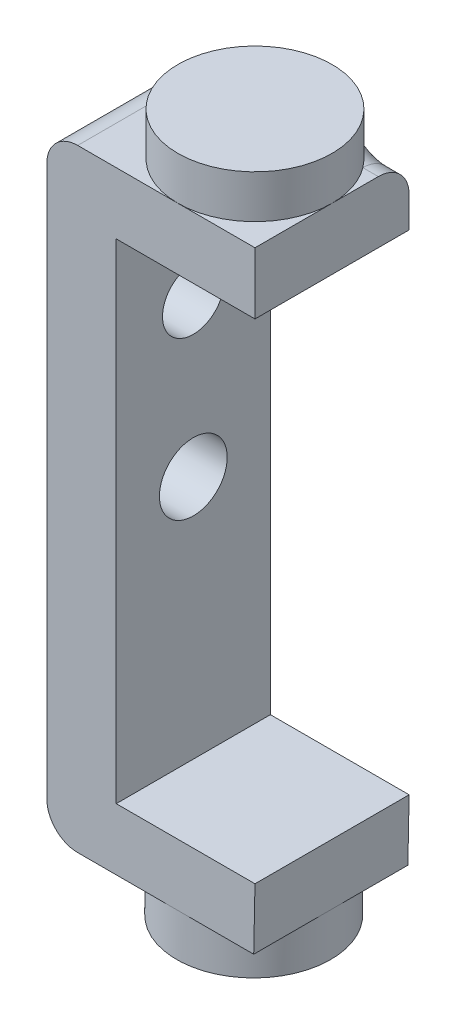
ISO-10303-21;
HEADER;
FILE_DESCRIPTION(('STEP AP214'),'2;1');
FILE_NAME('part.step','',(''),(''),'','','');
FILE_SCHEMA(('AUTOMOTIVE_DESIGN { 1 0 10303 214 1 1 1 1 }'));
ENDSEC;
DATA;
#1=APPLICATION_CONTEXT('core data for automotive mechanical design processes');
#2=APPLICATION_PROTOCOL_DEFINITION('international standard','automotive_design',2000,#1);
#3=PRODUCT_CONTEXT('',#1,'mechanical');
#4=PRODUCT('Part','Part','',(#3));
#5=PRODUCT_RELATED_PRODUCT_CATEGORY('part','',(#4));
#6=PRODUCT_DEFINITION_FORMATION('','',#4);
#7=PRODUCT_DEFINITION_CONTEXT('part definition',#1,'design');
#8=PRODUCT_DEFINITION('design','',#6,#7);
#9=PRODUCT_DEFINITION_SHAPE('','',#8);
#10=(LENGTH_UNIT() NAMED_UNIT(*) SI_UNIT(.MILLI.,.METRE.));
#11=(NAMED_UNIT(*) PLANE_ANGLE_UNIT() SI_UNIT($,.RADIAN.));
#12=(NAMED_UNIT(*) SI_UNIT($,.STERADIAN.) SOLID_ANGLE_UNIT());
#13=UNCERTAINTY_MEASURE_WITH_UNIT(LENGTH_MEASURE(1.E-05),#10,'distance_accuracy_value','');
#14=(GEOMETRIC_REPRESENTATION_CONTEXT(3) GLOBAL_UNCERTAINTY_ASSIGNED_CONTEXT((#13)) GLOBAL_UNIT_ASSIGNED_CONTEXT((#10,
#11,#12)) REPRESENTATION_CONTEXT('',''));
#15=CARTESIAN_POINT('',(0.,0.,0.));
#16=DIRECTION('',(0.,0.,1.));
#17=DIRECTION('',(1.,0.,0.));
#18=AXIS2_PLACEMENT_3D('',#15,#16,#17);
#19=CARTESIAN_POINT('',(-4.25,-9.93292427062988,5.));
#20=DIRECTION('',(0.,1.,0.));
#21=DIRECTION('',(0.,0.,1.));
#22=AXIS2_PLACEMENT_3D('',#19,#20,#21);
#23=PLANE('',#22);
#24=CARTESIAN_POINT('',(-0.040950298309327,-9.93292427062988,2.5));
#25=DIRECTION('',(0.,-1.,0.));
#26=DIRECTION('',(0.,0.,-1.));
#27=AXIS2_PLACEMENT_3D('',#24,#25,#26);
#28=CIRCLE('',#27,2.5);
#29=CARTESIAN_POINT('',(-0.040950298309327,-9.93292427062988,0.));
#30=VERTEX_POINT('',#29);
#31=CARTESIAN_POINT('',(2.45904970169067,-9.93292427062988,2.5));
#32=VERTEX_POINT('',#31);
#33=EDGE_CURVE('E181',#30,#32,#28,.T.);
#34=ORIENTED_EDGE('',*,*,#33,.F.);
#35=DIRECTION('',(1.,0.,0.));
#36=VECTOR('',#35,1.);
#37=CARTESIAN_POINT('',(-4.25,-9.93292427062988,0.));
#38=LINE('',#37,#36);
#39=CARTESIAN_POINT('',(2.45904970169067,-9.93292427062988,0.));
#40=VERTEX_POINT('',#39);
#41=EDGE_CURVE('E169',#30,#40,#38,.T.);
#42=ORIENTED_EDGE('',*,*,#41,.T.);
#43=DIRECTION('',(0.,0.,-1.));
#44=VECTOR('',#43,1.);
#45=CARTESIAN_POINT('',(2.45904970169067,-9.93292427062988,5.));
#46=LINE('',#45,#44);
#47=EDGE_CURVE('E182',#32,#40,#46,.T.);
#48=ORIENTED_EDGE('',*,*,#47,.F.);
#49=EDGE_LOOP('',(#34,#42,#48));
#50=FACE_BOUND('',#49,.T.);
#51=ADVANCED_FACE('F42',(#50),#23,.F.);
#52=CARTESIAN_POINT('',(-0.040950298309327,-9.93292427062988,5.));
#53=VERTEX_POINT('',#52);
#54=EDGE_CURVE('E190',#32,#53,#28,.T.);
#55=ORIENTED_EDGE('',*,*,#54,.F.);
#56=CARTESIAN_POINT('',(2.45904970169067,-9.93292427062988,5.));
#57=VERTEX_POINT('',#56);
#58=EDGE_CURVE('E259',#57,#32,#46,.T.);
#59=ORIENTED_EDGE('',*,*,#58,.F.);
#60=DIRECTION('',(1.,0.,0.));
#61=VECTOR('',#60,1.);
#62=CARTESIAN_POINT('',(-4.25,-9.93292427062988,5.));
#63=LINE('',#62,#61);
#64=EDGE_CURVE('E234',#53,#57,#63,.T.);
#65=ORIENTED_EDGE('',*,*,#64,.F.);
#66=EDGE_LOOP('',(#55,#59,#65));
#67=FACE_BOUND('',#66,.T.);
#68=ADVANCED_FACE('F385',(#67),#23,.F.);
#69=CARTESIAN_POINT('',(-4.25,9.93292427062988,5.));
#70=DIRECTION('',(0.,-1.,0.));
#71=DIRECTION('',(0.,0.,-1.));
#72=AXIS2_PLACEMENT_3D('',#69,#70,#71);
#73=PLANE('',#72);
#74=CARTESIAN_POINT('',(0.,9.93292427062988,2.5));
#75=DIRECTION('',(0.,1.,0.));
#76=DIRECTION('',(0.,0.,1.));
#77=AXIS2_PLACEMENT_3D('',#74,#75,#76);
#78=CIRCLE('',#77,2.5);
#79=CARTESIAN_POINT('',(0.,9.93292427062988,5.));
#80=VERTEX_POINT('',#79);
#81=CARTESIAN_POINT('',(2.5,9.93292427062988,2.5));
#82=VERTEX_POINT('',#81);
#83=EDGE_CURVE('E208',#80,#82,#78,.T.);
#84=ORIENTED_EDGE('',*,*,#83,.F.);
#85=DIRECTION('',(-1.,0.,0.));
#86=VECTOR('',#85,1.);
#87=CARTESIAN_POINT('',(-4.25,9.93292427062988,5.));
#88=LINE('',#87,#86);
#89=CARTESIAN_POINT('',(2.5,9.93292427062988,5.));
#90=VERTEX_POINT('',#89);
#91=EDGE_CURVE('E227',#90,#80,#88,.T.);
#92=ORIENTED_EDGE('',*,*,#91,.F.);
#93=DIRECTION('',(0.,0.,-1.));
#94=VECTOR('',#93,1.);
#95=CARTESIAN_POINT('',(2.5,9.93292427062988,5.));
#96=LINE('',#95,#94);
#97=EDGE_CURVE('E263',#90,#82,#96,.T.);
#98=ORIENTED_EDGE('',*,*,#97,.T.);
#99=EDGE_LOOP('',(#84,#92,#98));
#100=FACE_BOUND('',#99,.T.);
#101=ADVANCED_FACE('F389',(#100),#73,.F.);
#102=CARTESIAN_POINT('',(2.5,9.93292427062988,1.));
#103=VERTEX_POINT('',#102);
#104=EDGE_CURVE('E262',#82,#103,#96,.T.);
#105=ORIENTED_EDGE('',*,*,#104,.T.);
#106=DIRECTION('',(-1.,0.,0.));
#107=VECTOR('',#106,1.);
#108=CARTESIAN_POINT('',(0.,9.93292427062988,1.));
#109=LINE('',#108,#107);
#110=CARTESIAN_POINT('',(2.,9.93292427062988,1.));
#111=VERTEX_POINT('',#110);
#112=EDGE_CURVE('E295',#103,#111,#109,.T.);
#113=ORIENTED_EDGE('',*,*,#112,.T.);
#114=EDGE_CURVE('E193',#82,#111,#78,.T.);
#115=ORIENTED_EDGE('',*,*,#114,.F.);
#116=EDGE_LOOP('',(#105,#113,#115));
#117=FACE_BOUND('',#116,.T.);
#118=ADVANCED_FACE('F407',(#117),#73,.F.);
#119=CARTESIAN_POINT('',(2.5,-7.93292379379272,5.));
#120=DIRECTION('',(0.,-1.,0.));
#121=DIRECTION('',(0.,0.,-1.));
#122=AXIS2_PLACEMENT_3D('',#119,#120,#121);
#123=PLANE('',#122);
#124=DIRECTION('',(-1.,0.,0.));
#125=VECTOR('',#124,1.);
#126=CARTESIAN_POINT('',(2.5,-7.93292379379272,0.));
#127=LINE('',#126,#125);
#128=CARTESIAN_POINT('',(2.5,-7.93292379379272,0.));
#129=VERTEX_POINT('',#128);
#130=CARTESIAN_POINT('',(-2.,-7.93292379379272,0.));
#131=VERTEX_POINT('',#130);
#132=EDGE_CURVE('E207',#129,#131,#127,.T.);
#133=ORIENTED_EDGE('',*,*,#132,.T.);
#134=DIRECTION('',(0.,0.,-1.));
#135=VECTOR('',#134,1.);
#136=CARTESIAN_POINT('',(-2.,-7.93292379379272,5.));
#137=LINE('',#136,#135);
#138=CARTESIAN_POINT('',(-2.,-7.93292379379272,5.));
#139=VERTEX_POINT('',#138);
#140=EDGE_CURVE('E275',#139,#131,#137,.T.);
#141=ORIENTED_EDGE('',*,*,#140,.F.);
#142=DIRECTION('',(-1.,0.,0.));
#143=VECTOR('',#142,1.);
#144=CARTESIAN_POINT('',(2.5,-7.93292379379272,5.));
#145=LINE('',#144,#143);
#146=CARTESIAN_POINT('',(2.5,-7.93292379379272,5.));
#147=VERTEX_POINT('',#146);
#148=EDGE_CURVE('E213',#147,#139,#145,.T.);
#149=ORIENTED_EDGE('',*,*,#148,.F.);
#150=DIRECTION('',(0.,0.,-1.));
#151=VECTOR('',#150,1.);
#152=CARTESIAN_POINT('',(2.5,-7.93292379379272,5.));
#153=LINE('',#152,#151);
#154=EDGE_CURVE('E241',#147,#129,#153,.T.);
#155=ORIENTED_EDGE('',*,*,#154,.T.);
#156=EDGE_LOOP('',(#133,#141,#149,#155));
#157=FACE_BOUND('',#156,.T.);
#158=ADVANCED_FACE('F466',(#157),#123,.F.);
#159=CARTESIAN_POINT('',(-2.,-7.93292379379272,5.));
#160=DIRECTION('',(-1.,0.,0.));
#161=DIRECTION('',(0.,0.,1.));
#162=AXIS2_PLACEMENT_3D('',#159,#160,#161);
#163=PLANE('',#162);
#164=CARTESIAN_POINT('',(-2.,5.,2.5));
#165=DIRECTION('',(1.,0.,0.));
#166=DIRECTION('',(0.,0.,-1.));
#167=AXIS2_PLACEMENT_3D('',#164,#165,#166);
#168=CIRCLE('',#167,1.);
#169=CARTESIAN_POINT('',(-2.,5.,1.5));
#170=VERTEX_POINT('',#169);
#171=EDGE_CURVE('E283',#170,#170,#168,.T.);
#172=ORIENTED_EDGE('',*,*,#171,.F.);
#173=EDGE_LOOP('',(#172));
#174=FACE_BOUND('',#173,.T.);
#175=CARTESIAN_POINT('',(-2.,0.,2.5));
#176=DIRECTION('',(1.,0.,0.));
#177=DIRECTION('',(0.,0.,-1.));
#178=AXIS2_PLACEMENT_3D('',#175,#176,#177);
#179=CIRCLE('',#178,1.1);
#180=CARTESIAN_POINT('',(-2.,0.,1.4));
#181=VERTEX_POINT('',#180);
#182=EDGE_CURVE('E444',#181,#181,#179,.T.);
#183=ORIENTED_EDGE('',*,*,#182,.F.);
#184=EDGE_LOOP('',(#183));
#185=FACE_BOUND('',#184,.T.);
#186=DIRECTION('',(0.,1.,0.));
#187=VECTOR('',#186,1.);
#188=CARTESIAN_POINT('',(-2.,-7.93292379379272,0.));
#189=LINE('',#188,#187);
#190=CARTESIAN_POINT('',(-2.,7.93292379379272,0.));
#191=VERTEX_POINT('',#190);
#192=EDGE_CURVE('E245',#131,#191,#189,.T.);
#193=ORIENTED_EDGE('',*,*,#192,.T.);
#194=DIRECTION('',(0.,0.,-1.));
#195=VECTOR('',#194,1.);
#196=CARTESIAN_POINT('',(-2.,7.93292379379272,5.));
#197=LINE('',#196,#195);
#198=CARTESIAN_POINT('',(-2.,7.93292379379272,5.));
#199=VERTEX_POINT('',#198);
#200=EDGE_CURVE('E271',#199,#191,#197,.T.);
#201=ORIENTED_EDGE('',*,*,#200,.F.);
#202=DIRECTION('',(0.,1.,0.));
#203=VECTOR('',#202,1.);
#204=CARTESIAN_POINT('',(-2.,-7.93292379379272,5.));
#205=LINE('',#204,#203);
#206=EDGE_CURVE('E217',#139,#199,#205,.T.);
#207=ORIENTED_EDGE('',*,*,#206,.F.);
#208=ORIENTED_EDGE('',*,*,#140,.T.);
#209=EDGE_LOOP('',(#193,#201,#207,#208));
#210=FACE_BOUND('',#209,.T.);
#211=ADVANCED_FACE('F462',(#174,#185,#210),#163,.F.);
#212=CARTESIAN_POINT('',(-2.,7.93292379379272,5.));
#213=DIRECTION('',(0.,1.,0.));
#214=DIRECTION('',(0.,0.,1.));
#215=AXIS2_PLACEMENT_3D('',#212,#213,#214);
#216=PLANE('',#215);
#217=DIRECTION('',(1.,0.,0.));
#218=VECTOR('',#217,1.);
#219=CARTESIAN_POINT('',(-2.,7.93292379379272,0.));
#220=LINE('',#219,#218);
#221=CARTESIAN_POINT('',(2.5,7.93292379379272,0.));
#222=VERTEX_POINT('',#221);
#223=EDGE_CURVE('E248',#191,#222,#220,.T.);
#224=ORIENTED_EDGE('',*,*,#223,.T.);
#225=DIRECTION('',(0.,0.,-1.));
#226=VECTOR('',#225,1.);
#227=CARTESIAN_POINT('',(2.5,7.93292379379272,5.));
#228=LINE('',#227,#226);
#229=CARTESIAN_POINT('',(2.5,7.93292379379272,5.));
#230=VERTEX_POINT('',#229);
#231=EDGE_CURVE('E267',#230,#222,#228,.T.);
#232=ORIENTED_EDGE('',*,*,#231,.F.);
#233=DIRECTION('',(1.,0.,0.));
#234=VECTOR('',#233,1.);
#235=CARTESIAN_POINT('',(-2.,7.93292379379272,5.));
#236=LINE('',#235,#234);
#237=EDGE_CURVE('E220',#199,#230,#236,.T.);
#238=ORIENTED_EDGE('',*,*,#237,.F.);
#239=ORIENTED_EDGE('',*,*,#200,.T.);
#240=EDGE_LOOP('',(#224,#232,#238,#239));
#241=FACE_BOUND('',#240,.T.);
#242=ADVANCED_FACE('F465',(#241),#216,.F.);
#243=CARTESIAN_POINT('',(2.5,7.93292379379272,5.));
#244=DIRECTION('',(-1.,0.,0.));
#245=DIRECTION('',(0.,0.,1.));
#246=AXIS2_PLACEMENT_3D('',#243,#244,#245);
#247=PLANE('',#246);
#248=DIRECTION('',(0.,1.,0.));
#249=VECTOR('',#248,1.);
#250=CARTESIAN_POINT('',(2.5,7.93292379379272,0.));
#251=LINE('',#250,#249);
#252=CARTESIAN_POINT('',(2.5,8.93292427062988,0.));
#253=VERTEX_POINT('',#252);
#254=EDGE_CURVE('E179',#222,#253,#251,.T.);
#255=ORIENTED_EDGE('',*,*,#254,.T.);
#256=CARTESIAN_POINT('',(2.5,8.93292427062988,1.));
#257=DIRECTION('',(-1.,0.,0.));
#258=DIRECTION('',(0.,0.,1.));
#259=AXIS2_PLACEMENT_3D('',#256,#257,#258);
#260=CIRCLE('',#259,1.);
#261=EDGE_CURVE('E480',#253,#103,#260,.F.);
#262=ORIENTED_EDGE('',*,*,#261,.T.);
#263=ORIENTED_EDGE('',*,*,#104,.F.);
#264=ORIENTED_EDGE('',*,*,#97,.F.);
#265=DIRECTION('',(0.,1.,0.));
#266=VECTOR('',#265,1.);
#267=CARTESIAN_POINT('',(2.5,7.93292379379272,5.));
#268=LINE('',#267,#266);
#269=EDGE_CURVE('E223',#230,#90,#268,.T.);
#270=ORIENTED_EDGE('',*,*,#269,.F.);
#271=ORIENTED_EDGE('',*,*,#231,.T.);
#272=EDGE_LOOP('',(#255,#262,#263,#264,#270,#271));
#273=FACE_BOUND('',#272,.T.);
#274=ADVANCED_FACE('F405',(#273),#247,.F.);
#275=CARTESIAN_POINT('',(-2.,9.93292427062988,1.));
#276=VERTEX_POINT('',#275);
#277=EDGE_CURVE('E212',#276,#80,#78,.T.);
#278=ORIENTED_EDGE('',*,*,#277,.F.);
#279=DIRECTION('',(-1.,0.,0.));
#280=VECTOR('',#279,1.);
#281=CARTESIAN_POINT('',(-3.25,9.93292427062988,1.));
#282=LINE('',#281,#280);
#283=CARTESIAN_POINT('',(-3.25,9.93292427062988,1.));
#284=VERTEX_POINT('',#283);
#285=EDGE_CURVE('E484',#276,#284,#282,.T.);
#286=ORIENTED_EDGE('',*,*,#285,.T.);
#287=DIRECTION('',(0.,0.,-1.));
#288=VECTOR('',#287,1.);
#289=CARTESIAN_POINT('',(-3.25,9.93292427062988,5.));
#290=LINE('',#289,#288);
#291=CARTESIAN_POINT('',(-3.25,9.93292427062988,5.));
#292=VERTEX_POINT('',#291);
#293=EDGE_CURVE('E289',#284,#292,#290,.F.);
#294=ORIENTED_EDGE('',*,*,#293,.T.);
#295=EDGE_CURVE('E226',#80,#292,#88,.T.);
#296=ORIENTED_EDGE('',*,*,#295,.F.);
#297=EDGE_LOOP('',(#278,#286,#294,#296));
#298=FACE_BOUND('',#297,.T.);
#299=ADVANCED_FACE('F400',(#298),#73,.F.);
#300=CARTESIAN_POINT('',(-4.25,9.93292427062988,5.));
#301=DIRECTION('',(1.,0.,0.));
#302=DIRECTION('',(0.,0.,-1.));
#303=AXIS2_PLACEMENT_3D('',#300,#301,#302);
#304=PLANE('',#303);
#305=CARTESIAN_POINT('',(-4.25,5.,2.5));
#306=DIRECTION('',(1.,0.,0.));
#307=DIRECTION('',(0.,0.,-1.));
#308=AXIS2_PLACEMENT_3D('',#305,#306,#307);
#309=CIRCLE('',#308,1.);
#310=CARTESIAN_POINT('',(-4.25,5.,1.5));
#311=VERTEX_POINT('',#310);
#312=EDGE_CURVE('E188',#311,#311,#309,.T.);
#313=ORIENTED_EDGE('',*,*,#312,.T.);
#314=EDGE_LOOP('',(#313));
#315=FACE_BOUND('',#314,.T.);
#316=CARTESIAN_POINT('',(-4.25,0.,2.5));
#317=DIRECTION('',(1.,0.,0.));
#318=DIRECTION('',(0.,0.,-1.));
#319=AXIS2_PLACEMENT_3D('',#316,#317,#318);
#320=CIRCLE('',#319,1.1);
#321=CARTESIAN_POINT('',(-4.25,0.,1.4));
#322=VERTEX_POINT('',#321);
#323=EDGE_CURVE('E279',#322,#322,#320,.T.);
#324=ORIENTED_EDGE('',*,*,#323,.T.);
#325=EDGE_LOOP('',(#324));
#326=FACE_BOUND('',#325,.T.);
#327=DIRECTION('',(0.,0.,-1.));
#328=VECTOR('',#327,1.);
#329=CARTESIAN_POINT('',(-4.25,8.93292427062988,5.));
#330=LINE('',#329,#328);
#331=CARTESIAN_POINT('',(-4.25,8.93292427062988,5.));
#332=VERTEX_POINT('',#331);
#333=CARTESIAN_POINT('',(-4.25,8.93292427062988,1.));
#334=VERTEX_POINT('',#333);
#335=EDGE_CURVE('E196',#332,#334,#330,.T.);
#336=ORIENTED_EDGE('',*,*,#335,.T.);
#337=DIRECTION('',(0.,-1.,0.));
#338=VECTOR('',#337,1.);
#339=CARTESIAN_POINT('',(-4.25,-9.93292427062988,1.));
#340=LINE('',#339,#338);
#341=CARTESIAN_POINT('',(-4.25,-8.93292427062988,1.));
#342=VERTEX_POINT('',#341);
#343=EDGE_CURVE('E66',#334,#342,#340,.T.);
#344=ORIENTED_EDGE('',*,*,#343,.T.);
#345=DIRECTION('',(0.,0.,-1.));
#346=VECTOR('',#345,1.);
#347=CARTESIAN_POINT('',(-4.25,-8.93292427062988,5.));
#348=LINE('',#347,#346);
#349=CARTESIAN_POINT('',(-4.25,-8.93292427062988,5.));
#350=VERTEX_POINT('',#349);
#351=EDGE_CURVE('E493',#342,#350,#348,.F.);
#352=ORIENTED_EDGE('',*,*,#351,.T.);
#353=DIRECTION('',(0.,-1.,0.));
#354=VECTOR('',#353,1.);
#355=CARTESIAN_POINT('',(-4.25,9.93292427062988,5.));
#356=LINE('',#355,#354);
#357=EDGE_CURVE('E231',#332,#350,#356,.T.);
#358=ORIENTED_EDGE('',*,*,#357,.F.);
#359=EDGE_LOOP('',(#336,#344,#352,#358));
#360=FACE_BOUND('',#359,.T.);
#361=ADVANCED_FACE('F393',(#315,#326,#360),#304,.F.);
#362=CARTESIAN_POINT('',(-3.25,-9.93292427062988,5.));
#363=VERTEX_POINT('',#362);
#364=EDGE_CURVE('E235',#363,#53,#63,.T.);
#365=ORIENTED_EDGE('',*,*,#364,.F.);
#366=DIRECTION('',(0.,0.,-1.));
#367=VECTOR('',#366,1.);
#368=CARTESIAN_POINT('',(-3.25,-9.93292427062988,5.));
#369=LINE('',#368,#367);
#370=CARTESIAN_POINT('',(-3.25,-9.93292427062988,0.));
#371=VERTEX_POINT('',#370);
#372=EDGE_CURVE('E52',#363,#371,#369,.T.);
#373=ORIENTED_EDGE('',*,*,#372,.T.);
#374=EDGE_CURVE('E158',#371,#30,#38,.T.);
#375=ORIENTED_EDGE('',*,*,#374,.T.);
#376=EDGE_CURVE('E162',#53,#30,#28,.T.);
#377=ORIENTED_EDGE('',*,*,#376,.F.);
#378=EDGE_LOOP('',(#365,#373,#375,#377));
#379=FACE_BOUND('',#378,.T.);
#380=ADVANCED_FACE('F160',(#379),#23,.F.);
#381=CARTESIAN_POINT('',(2.5,-7.93292379379272,5.));
#382=DIRECTION('',(-0.999790450118637,0.020470853708955,0.));
#383=DIRECTION('',(-0.020470853708955,-0.999790450118637,0.));
#384=AXIS2_PLACEMENT_3D('',#381,#382,#383);
#385=PLANE('',#384);
#386=DIRECTION('',(0.020470853708955,0.999790450118637,0.));
#387=VECTOR('',#386,1.);
#388=CARTESIAN_POINT('',(2.5,-7.93292379379272,0.));
#389=LINE('',#388,#387);
#390=EDGE_CURVE('E168',#40,#129,#389,.T.);
#391=ORIENTED_EDGE('',*,*,#390,.T.);
#392=ORIENTED_EDGE('',*,*,#154,.F.);
#393=DIRECTION('',(0.020470853708955,0.999790450118637,0.));
#394=VECTOR('',#393,1.);
#395=CARTESIAN_POINT('',(2.5,-7.93292379379272,5.));
#396=LINE('',#395,#394);
#397=EDGE_CURVE('E238',#57,#147,#396,.T.);
#398=ORIENTED_EDGE('',*,*,#397,.F.);
#399=ORIENTED_EDGE('',*,*,#58,.T.);
#400=ORIENTED_EDGE('',*,*,#47,.T.);
#401=EDGE_LOOP('',(#391,#392,#398,#399,#400));
#402=FACE_BOUND('',#401,.T.);
#403=ADVANCED_FACE('F331',(#402),#385,.F.);
#404=CARTESIAN_POINT('',(0.,0.,5.));
#405=DIRECTION('',(0.,0.,-1.));
#406=DIRECTION('',(-1.,0.,0.));
#407=AXIS2_PLACEMENT_3D('',#404,#405,#406);
#408=PLANE('',#407);
#409=ORIENTED_EDGE('',*,*,#357,.T.);
#410=CARTESIAN_POINT('',(-3.25,-8.93292427062988,5.));
#411=DIRECTION('',(0.,0.,-1.));
#412=DIRECTION('',(-1.,0.,0.));
#413=AXIS2_PLACEMENT_3D('',#410,#411,#412);
#414=CIRCLE('',#413,1.);
#415=EDGE_CURVE('E11',#350,#363,#414,.F.);
#416=ORIENTED_EDGE('',*,*,#415,.T.);
#417=ORIENTED_EDGE('',*,*,#364,.T.);
#418=ORIENTED_EDGE('',*,*,#64,.T.);
#419=ORIENTED_EDGE('',*,*,#397,.T.);
#420=ORIENTED_EDGE('',*,*,#148,.T.);
#421=ORIENTED_EDGE('',*,*,#206,.T.);
#422=ORIENTED_EDGE('',*,*,#237,.T.);
#423=ORIENTED_EDGE('',*,*,#269,.T.);
#424=ORIENTED_EDGE('',*,*,#91,.T.);
#425=ORIENTED_EDGE('',*,*,#295,.T.);
#426=CARTESIAN_POINT('',(-3.25,8.93292427062988,5.));
#427=DIRECTION('',(0.,0.,-1.));
#428=DIRECTION('',(-1.,0.,0.));
#429=AXIS2_PLACEMENT_3D('',#426,#427,#428);
#430=CIRCLE('',#429,1.);
#431=EDGE_CURVE('E292',#292,#332,#430,.F.);
#432=ORIENTED_EDGE('',*,*,#431,.T.);
#433=EDGE_LOOP('',(#409,#416,#417,#418,#419,#420,#421,#422,#423,#424,#425,#432));
#434=FACE_BOUND('',#433,.T.);
#435=ADVANCED_FACE('F329',(#434),#408,.F.);
#436=CARTESIAN_POINT('',(0.,0.,0.));
#437=DIRECTION('',(0.,0.,-1.));
#438=DIRECTION('',(-1.,0.,0.));
#439=AXIS2_PLACEMENT_3D('',#436,#437,#438);
#440=PLANE('',#439);
#441=CARTESIAN_POINT('',(2.41056525300064,8.99219527040474,0.));
#442=CARTESIAN_POINT('',(2.05974215000179,10.1382886559773,0.));
#443=CARTESIAN_POINT('',(2.12260489035087,9.93292427062988,1.17918643273982));
#444=CARTESIAN_POINT('',(2.34741300746021,8.97285120395736,0.));
#445=CARTESIAN_POINT('',(2.06536947315218,10.108136312756,0.));
#446=CARTESIAN_POINT('',(2.1070832940824,9.93292427062988,1.15427712393599));
#447=CARTESIAN_POINT('',(2.28291414926407,8.95850646976109,0.));
#448=CARTESIAN_POINT('',(2.06368722782517,10.0752389064583,0.));
#449=CARTESIAN_POINT('',(2.08991305284231,9.93292427062988,1.12762832738506));
#450=CARTESIAN_POINT('',(2.15291086520175,8.93910914666285,0.));
#451=CARTESIAN_POINT('',(2.04583555336829,10.0090084108998,0.));
#452=CARTESIAN_POINT('',(2.05180956292241,9.93292427062988,1.07127661267816));
#453=CARTESIAN_POINT('',(2.08741488006336,8.93400088461554,0.));
#454=CARTESIAN_POINT('',(2.03020901389255,9.97577122886298,0.));
#455=CARTESIAN_POINT('',(2.03089970051556,9.93292427062988,1.0415931402311));
#456=CARTESIAN_POINT('',(1.92330355150845,8.93169000599481,0.));
#457=CARTESIAN_POINT('',(1.97501351205391,9.89678420177626,0.));
#458=CARTESIAN_POINT('',(1.97304064000553,9.93292427062988,0.963604095405712));
#459=CARTESIAN_POINT('',(1.82461699825177,8.93976302901228,0.));
#460=CARTESIAN_POINT('',(1.92790833010601,9.85209890023132,0.));
#461=CARTESIAN_POINT('',(1.93331659650432,9.93292427062988,0.913447540578426));
#462=CARTESIAN_POINT('',(1.62965149140935,8.97173135967379,0.));
#463=CARTESIAN_POINT('',(1.81062440255386,9.776555794849,0.));
#464=CARTESIAN_POINT('',(1.8417188732821,9.93292427062988,0.807969341353568));
#465=CARTESIAN_POINT('',(1.53338313553576,8.99568679418965,0.));
#466=CARTESIAN_POINT('',(1.74142938693512,9.74516240979567,0.));
#467=CARTESIAN_POINT('',(1.7897995092833,9.93292427062988,0.752628757830457));
#468=CARTESIAN_POINT('',(1.36611108978296,9.04946904606941,0.));
#469=CARTESIAN_POINT('',(1.60418175215647,9.70385778987449,0.));
#470=CARTESIAN_POINT('',(1.68506582301952,9.93292427062988,0.652145186204753));
#471=CARTESIAN_POINT('',(1.29427019241365,9.07678639895708,0.));
#472=CARTESIAN_POINT('',(1.54015481711874,9.69048530018617,0.));
#473=CARTESIAN_POINT('',(1.63504585990737,9.93292427062988,0.607487933113791));
#474=CARTESIAN_POINT('',(1.15326532839366,9.13768492581362,0.));
#475=CARTESIAN_POINT('',(1.40575916143277,9.67334807589431,0.));
#476=CARTESIAN_POINT('',(1.52571734060085,9.93292427062988,0.518292663112166));
#477=CARTESIAN_POINT('',(1.08410310761721,9.17127010466544,0.));
#478=CARTESIAN_POINT('',(1.33547312644962,9.66928652942251,0.));
#479=CARTESIAN_POINT('',(1.46640284949285,9.93292427062988,0.473754741008985));
#480=CARTESIAN_POINT('',(0.948367092599598,9.24347641872249,0.));
#481=CARTESIAN_POINT('',(1.19078744539384,9.66988027351934,0.));
#482=CARTESIAN_POINT('',(1.33803851229932,9.93292427062988,0.386787728781546));
#483=CARTESIAN_POINT('',(0.881797180491649,9.28210475623119,0.));
#484=CARTESIAN_POINT('',(1.11630779368645,9.67431314252921,0.));
#485=CARTESIAN_POINT('',(1.26897473124187,9.93292427062988,0.344361776865004));
#486=CARTESIAN_POINT('',(0.751091645741637,9.36322019775007,0.));
#487=CARTESIAN_POINT('',(0.965033464513513,9.69054965662818,0.));
#488=CARTESIAN_POINT('',(1.12136466352074,9.93292427062988,0.264023761245656));
#489=CARTESIAN_POINT('',(0.686955605019411,9.40570663473899,0.));
#490=CARTESIAN_POINT('',(0.888034120156326,9.70220914848698,0.));
#491=CARTESIAN_POINT('',(1.04282001522035,9.93292427062988,0.22611091988696));
#492=CARTESIAN_POINT('',(0.570316840430507,9.48683707979888,0.));
#493=CARTESIAN_POINT('',(0.744513770289094,9.72910544942223,0.));
#494=CARTESIAN_POINT('',(0.88979896368219,9.93292427062988,0.162471668422755));
#495=CARTESIAN_POINT('',(0.517531472276504,9.52507912941759,0.));
#496=CARTESIAN_POINT('',(0.678154087526624,9.74346195066078,0.));
#497=CARTESIAN_POINT('',(0.816528487785982,9.93292427062988,0.135768548079749));
#498=CARTESIAN_POINT('',(0.413085533126555,9.60305819182426,0.));
#499=CARTESIAN_POINT('',(0.545053083376622,9.7752649364765,0.));
#500=CARTESIAN_POINT('',(0.664861401925382,9.93292427062988,0.088722683737484));
#501=CARTESIAN_POINT('',(0.361424924902969,9.64279515501399,0.));
#502=CARTESIAN_POINT('',(0.478079718093651,9.79272982747996,0.));
#503=CARTESIAN_POINT('',(0.586464961966542,9.93292427062988,0.0683797289289143));
#504=CARTESIAN_POINT('',(0.258936752067743,9.72320174145874,0.));
#505=CARTESIAN_POINT('',(0.3441415197336,9.82968026507731,0.));
#506=CARTESIAN_POINT('',(0.426049720847647,9.93292427062988,0.0352119924183268));
#507=CARTESIAN_POINT('',(0.208108292438834,9.76387023194217,0.));
#508=CARTESIAN_POINT('',(0.276915814473588,9.84921838493364,0.));
#509=CARTESIAN_POINT('',(0.344035217524058,9.93292427062988,0.02237853584892));
#510=CARTESIAN_POINT('',(0.106850645933649,9.84569785440168,0.));
#511=CARTESIAN_POINT('',(0.142601809566251,9.88928357460493,0.));
#512=CARTESIAN_POINT('',(0.178027112665346,9.93292427062988,0.00495106250303723));
#513=CARTESIAN_POINT('',(0.0564214569158744,9.88685698374324,0.));
#514=CARTESIAN_POINT('',(0.0752337598638542,9.90988958371664,0.));
#515=CARTESIAN_POINT('',(0.0940335217547388,9.93292427062988,0.000357001504479573));
#516=CARTESIAN_POINT('',(0.0039999998046421,9.92965828455482,0.));
#517=CARTESIAN_POINT('',(0.00533334660452678,9.93129127298417,0.));
#518=CARTESIAN_POINT('',(0.0066666824452796,9.93292427062988,6.63240605664479E-06));
#519=CARTESIAN_POINT('',(0.00199999979376105,9.93129127773217,0.));
#520=CARTESIAN_POINT('',(0.00266666946554298,9.93210777215301,0.));
#521=CARTESIAN_POINT('',(0.0033333519486578,9.93292427062988,-3.70791703350906E-08));
#522=CARTESIAN_POINT('',(0.,9.93292427062988,0.));
#523=CARTESIAN_POINT('',(0.,9.93292427062988,0.));
#524=CARTESIAN_POINT('',(1.78223835409486E-08,9.93292427062988,0.));
#525=(BOUNDED_SURFACE() B_SPLINE_SURFACE(3,2,((#441,#442,#443),(#444,#445,#446),(#447,#448,
#449),(#450,#451,#452),(#453,#454,#455),(#456,#457,#458),(#459,#460,#461),(#462,#463,#464),
(#465,#466,#467),(#468,#469,#470),(#471,#472,#473),(#474,#475,#476),(#477,#478,#479),(#480,#481,
#482),(#483,#484,#485),(#486,#487,#488),(#489,#490,#491),(#492,#493,#494),(#495,#496,#497),
(#498,#499,#500),(#501,#502,#503),(#504,#505,#506),(#507,#508,#509),(#510,#511,#512),(#513,#514,
#515),(#516,#517,#518),(#519,#520,#521),(#522,#523,#524)),.UNSPECIFIED.,.F.,.F.,
.F.) B_SPLINE_SURFACE_WITH_KNOTS((4,2,2,2,2,2,2,2,2,2,2,2,2,4),(3,3),(0.,0.1976767831062,
0.394158039646616,0.689569718094245,0.986106186969649,1.21635633611888,1.44675411249845,
1.67748460249363,1.90817527749933,2.10368932811841,2.29919689768719,2.49447817149303,
2.68975839719161,2.69750436388405),(0.,1.),
.UNSPECIFIED.) GEOMETRIC_REPRESENTATION_ITEM() RATIONAL_B_SPLINE_SURFACE(((1.,0.640629989643077,
1.),(1.,0.650355096893834,1.),(1.,0.660528578743928,1.),(1.,0.681520257977489,1.),(1.,
0.692334184080546,1.),(1.,0.720051463748259,1.),(1.,0.737279329770445,1.),(1.,0.772218307910616,
1.),(1.,0.789931010247237,1.),(1.,0.821044090243169,1.),(1.,0.834523356438621,1.),(1.,
0.860828938348294,1.),(1.,0.873654829875514,1.),(1.,0.898196611745281,1.),(1.,0.909910872406668,
1.),(1.,0.931722766995852,1.),(1.,0.941820679540894,1.),(1.,0.958552759142324,1.),(1.,
0.965480301641587,1.),(1.,0.977586544396539,1.),(1.,0.982765302616586,1.),(1.,0.991166884210939,
1.),(1.,0.994391964599051,1.),(1.,0.998763925351985,1.),(1.,0.999910816870761,1.),(1.,
0.999998339218082,1.),(1.,1.00000000637041,1.),(1.,1.,1.))) REPRESENTATION_ITEM('') SURFACE());
#526=CARTESIAN_POINT('',(2.41056525300064,8.99219527040474,0.));
#527=CARTESIAN_POINT('',(2.34741300746021,8.97285120395736,0.));
#528=CARTESIAN_POINT('',(2.28291414926407,8.95850646976109,0.));
#529=CARTESIAN_POINT('',(2.15291086520175,8.93910914666285,0.));
#530=CARTESIAN_POINT('',(2.08741488006336,8.93400088461554,0.));
#531=CARTESIAN_POINT('',(1.92330355150845,8.93169000599481,0.));
#532=CARTESIAN_POINT('',(1.82461699825177,8.93976302901228,0.));
#533=CARTESIAN_POINT('',(1.62965149140935,8.9717313596738,0.));
#534=CARTESIAN_POINT('',(1.53338313553576,8.99568679418965,0.));
#535=CARTESIAN_POINT('',(1.36611108978296,9.0494690460694,0.));
#536=CARTESIAN_POINT('',(1.29427019241365,9.07678639895708,0.));
#537=CARTESIAN_POINT('',(1.15326532839366,9.13768492581362,0.));
#538=CARTESIAN_POINT('',(1.08410310761721,9.17127010466544,0.));
#539=CARTESIAN_POINT('',(0.948367092599598,9.24347641872249,0.));
#540=CARTESIAN_POINT('',(0.881797180491649,9.28210475623119,0.));
#541=CARTESIAN_POINT('',(0.751091645741637,9.36322019775007,0.));
#542=CARTESIAN_POINT('',(0.686955605019411,9.40570663473899,0.));
#543=CARTESIAN_POINT('',(0.570316840430507,9.48683707979888,0.));
#544=CARTESIAN_POINT('',(0.517531472276504,9.52507912941759,0.));
#545=CARTESIAN_POINT('',(0.413085533126555,9.60305819182426,0.));
#546=CARTESIAN_POINT('',(0.361424924902969,9.64279515501399,0.));
#547=CARTESIAN_POINT('',(0.258936752067743,9.72320174145874,0.));
#548=CARTESIAN_POINT('',(0.208108292438834,9.76387023194217,0.));
#549=CARTESIAN_POINT('',(0.10685064593365,9.84569785440168,0.));
#550=CARTESIAN_POINT('',(0.0564214569158754,9.88685698374324,0.));
#551=CARTESIAN_POINT('',(0.0039999998046421,9.92965828455482,0.));
#552=CARTESIAN_POINT('',(0.00199999979376105,9.93129127773217,0.));
#553=CARTESIAN_POINT('',(0.,9.93292427062988,0.));
#554=B_SPLINE_CURVE_WITH_KNOTS('',3,(#526,#527,#528,#529,#530,#531,#532,#533,#534,#535,#536,
#537,#538,#539,#540,#541,#542,#543,#544,#545,#546,#547,#548,#549,#550,#551,#552,#553),
.UNSPECIFIED.,.F.,.F.,(4,2,2,2,2,2,2,2,2,2,2,2,2,4),(0.,0.1976767831062,0.394158039646616,
0.689569718094245,0.986106186969649,1.21635633611888,1.44675411249845,1.67748460249363,
1.90817527749933,2.10368932811841,2.29919689768719,2.49447817149303,2.68975839719161,
2.69750436388405),.UNSPECIFIED.);
#555=CARTESIAN_POINT('',(0.,9.93292427062988,0.));
#556=VERTEX_POINT('',#555);
#557=CARTESIAN_POINT('',(2.,8.93292427062988,0.));
#558=VERTEX_POINT('',#557);
#559=EDGE_CURVE('E314',#556,#558,#554,.F.);
#560=ORIENTED_EDGE('',*,*,#559,.T.);
#561=DIRECTION('',(-1.,0.,0.));
#562=VECTOR('',#561,1.);
#563=CARTESIAN_POINT('',(2.5,8.93292427062988,0.));
#564=LINE('',#563,#562);
#565=EDGE_CURVE('E476',#558,#253,#564,.F.);
#566=ORIENTED_EDGE('',*,*,#565,.T.);
#567=ORIENTED_EDGE('',*,*,#254,.F.);
#568=ORIENTED_EDGE('',*,*,#223,.F.);
#569=ORIENTED_EDGE('',*,*,#192,.F.);
#570=ORIENTED_EDGE('',*,*,#132,.F.);
#571=ORIENTED_EDGE('',*,*,#390,.F.);
#572=ORIENTED_EDGE('',*,*,#41,.F.);
#573=ORIENTED_EDGE('',*,*,#374,.F.);
#574=DIRECTION('',(0.,-1.,0.));
#575=VECTOR('',#574,1.);
#576=CARTESIAN_POINT('',(-3.25,8.93292427062988,0.));
#577=LINE('',#576,#575);
#578=CARTESIAN_POINT('',(-3.25,8.93292427062988,0.));
#579=VERTEX_POINT('',#578);
#580=EDGE_CURVE('E299',#371,#579,#577,.F.);
#581=ORIENTED_EDGE('',*,*,#580,.T.);
#582=DIRECTION('',(-1.,0.,0.));
#583=VECTOR('',#582,1.);
#584=CARTESIAN_POINT('',(0.,8.93292427062988,0.));
#585=LINE('',#584,#583);
#586=CARTESIAN_POINT('',(-2.,8.93292427062988,0.));
#587=VERTEX_POINT('',#586);
#588=EDGE_CURVE('E302',#579,#587,#585,.F.);
#589=ORIENTED_EDGE('',*,*,#588,.T.);
#590=CARTESIAN_POINT('',(-2.12260487597167,9.93292427062988,1.17918640963181));
#591=CARTESIAN_POINT('',(-2.05974214235995,10.1382886237118,0.));
#592=CARTESIAN_POINT('',(-2.41056525300146,8.99219527040499,0.));
#593=CARTESIAN_POINT('',(-2.10708328885178,9.93292427062988,1.15427711553022));
#594=CARTESIAN_POINT('',(-2.06536947038545,10.1081363013465,0.));
#595=CARTESIAN_POINT('',(-2.34741300746069,8.97285120395725,0.));
#596=CARTESIAN_POINT('',(-2.08991305142588,9.93292427062988,1.12762832510884));
#597=CARTESIAN_POINT('',(-2.06368722708977,10.0752389034603,0.));
#598=CARTESIAN_POINT('',(-2.28291414926416,8.95850646976086,0.));
#599=CARTESIAN_POINT('',(-2.05180956433025,9.93292427062988,1.0712766149406));
#600=CARTESIAN_POINT('',(-2.04583555405364,10.0090084137016,0.));
#601=CARTESIAN_POINT('',(-2.15291086520187,8.93910914666273,0.));
#602=CARTESIAN_POINT('',(-2.03089970096245,9.93292427062988,1.04159314094916));
#603=CARTESIAN_POINT('',(-2.03020901410058,9.97577122972481,0.));
#604=CARTESIAN_POINT('',(-2.08741488006391,8.93400088461554,0.));
#605=CARTESIAN_POINT('',(-1.97304063933486,9.93292427062988,0.963604094327765));
#606=CARTESIAN_POINT('',(-1.97501351178663,9.89678420057821,0.));
#607=CARTESIAN_POINT('',(-1.9233035515095,8.93169000599483,0.));
#608=CARTESIAN_POINT('',(-1.9333165963257,9.93292427062988,0.913447540291384));
#609=CARTESIAN_POINT('',(-1.92790833004362,9.85209889992658,0.));
#610=CARTESIAN_POINT('',(-1.82461699825288,8.93976302901218,0.));
#611=CARTESIAN_POINT('',(-1.84171887346163,9.93292427062988,0.807969341641968));
#612=CARTESIAN_POINT('',(-1.81062440259707,9.7765557951302,0.));
#613=CARTESIAN_POINT('',(-1.62965149141057,8.97173135967351,0.));
#614=CARTESIAN_POINT('',(-1.78979950932655,9.93292427062988,0.752628757899551));
#615=CARTESIAN_POINT('',(-1.74142938694381,9.74516240986011,0.));
#616=CARTESIAN_POINT('',(-1.53338313553702,8.99568679418931,0.));
#617=CARTESIAN_POINT('',(-1.68506582298812,9.93292427062988,0.652145186153206));
#618=CARTESIAN_POINT('',(-1.60418175215597,9.70385778982832,0.));
#619=CARTESIAN_POINT('',(-1.36611108978434,9.04946904606891,0.));
#620=CARTESIAN_POINT('',(-1.63504585990018,9.93292427062988,0.607487933100796));
#621=CARTESIAN_POINT('',(-1.54015481712036,9.69048530017423,0.));
#622=CARTESIAN_POINT('',(-1.2942701924151,9.07678639895651,0.));
#623=CARTESIAN_POINT('',(-1.5257173406102,9.93292427062988,0.51829266312693));
#624=CARTESIAN_POINT('',(-1.40575916143304,9.67334807590609,0.));
#625=CARTESIAN_POINT('',(-1.15326532839525,9.13768492581288,0.));
#626=CARTESIAN_POINT('',(-1.46640284949452,9.93292427062988,0.473754741012925));
#627=CARTESIAN_POINT('',(-1.33547312644946,9.66928652942561,0.));
#628=CARTESIAN_POINT('',(-1.08410310761887,9.17127010466462,0.));
#629=CARTESIAN_POINT('',(-1.33803851230058,9.93292427062988,0.386787728779589));
#630=CARTESIAN_POINT('',(-1.19078744539757,9.66988027351624,0.));
#631=CARTESIAN_POINT('',(-0.948367092601365,9.24347641872149,0.));
#632=CARTESIAN_POINT('',(-1.26897473125041,9.93292427062988,0.344361776867998));
#633=CARTESIAN_POINT('',(-1.11630779369348,9.67431314252828,0.));
#634=CARTESIAN_POINT('',(-0.881797180493465,9.28210475623009,0.));
#635=CARTESIAN_POINT('',(-1.12136466351898,9.93292427062988,0.264023761246357));
#636=CARTESIAN_POINT('',(-0.965033464512639,9.69054965662891,0.));
#637=CARTESIAN_POINT('',(-0.751091645743585,9.36322019774883,0.));
#638=CARTESIAN_POINT('',(-1.04282001520101,9.93292427062988,0.22611091988042));
#639=CARTESIAN_POINT('',(-0.88803412014516,9.70220914848718,0.));
#640=CARTESIAN_POINT('',(-0.686955605021441,9.40570663473769,0.));
#641=CARTESIAN_POINT('',(-0.889798963700024,9.93292427062988,0.162471668428899));
#642=CARTESIAN_POINT('',(-0.744513770300564,9.72910544942113,0.));
#643=CARTESIAN_POINT('',(-0.570316840432239,9.48683707979757,0.));
#644=CARTESIAN_POINT('',(-0.816528487847842,9.93292427062988,0.135768548101849));
#645=CARTESIAN_POINT('',(-0.678154087563213,9.74346195065915,0.));
#646=CARTESIAN_POINT('',(-0.517531472277882,9.52507912941638,0.));
#647=CARTESIAN_POINT('',(-0.664861401865665,9.93292427062988,0.0887226837160506));
#648=CARTESIAN_POINT('',(-0.545053083343529,9.77526493647717,0.));
#649=CARTESIAN_POINT('',(-0.413085533127576,9.60305819182368,0.));
#650=CARTESIAN_POINT('',(-0.586464961741228,9.93292427062988,0.0683797288479961));
#651=CARTESIAN_POINT('',(-0.478079717969686,9.79272982748276,0.));
#652=CARTESIAN_POINT('',(-0.361424924903988,9.64279515501397,0.));
#653=CARTESIAN_POINT('',(-0.426049721076796,9.93292427062988,0.0352119924999981));
#654=CARTESIAN_POINT('',(-0.344141519856607,9.82968026507548,0.));
#655=CARTESIAN_POINT('',(-0.258936752068424,9.72320174145897,0.));
#656=CARTESIAN_POINT('',(-0.344035218372371,9.93292427062988,0.0223785361523101));
#657=CARTESIAN_POINT('',(-0.27691581492132,9.84921838492778,0.));
#658=CARTESIAN_POINT('',(-0.208108292439175,9.7638702319421,0.));
#659=CARTESIAN_POINT('',(-0.17802711181348,9.93292427062988,0.00495106219927537));
#660=CARTESIAN_POINT('',(-0.142601809129068,9.88928357460757,0.));
#661=CARTESIAN_POINT('',(-0.106850645933669,9.84569785440145,0.));
#662=CARTESIAN_POINT('',(-0.0940335185835423,9.93292427062988,0.000357000371851907));
#663=CARTESIAN_POINT('',(-0.0752337582572531,9.90988958372104,0.));
#664=CARTESIAN_POINT('',(-0.0564214569159124,9.88685698374316,0.));
#665=CARTESIAN_POINT('',(-0.0066666492207892,9.93292427062988,6.63231758234667E-06));
#666=CARTESIAN_POINT('',(-0.00533332999216879,9.93129127298405,0.));
#667=CARTESIAN_POINT('',(-0.00399999980464125,9.92965828455482,0.));
#668=CARTESIAN_POINT('',(-0.00333331753572893,9.93292427062988,-3.71249232223849E-08));
#669=CARTESIAN_POINT('',(-0.00266665225906513,9.93210777215294,0.));
#670=CARTESIAN_POINT('',(-0.00199999979376068,9.93129127773217,0.));
#671=CARTESIAN_POINT('',(1.78223835409486E-08,9.93292427062988,0.));
#672=CARTESIAN_POINT('',(1.78223835409486E-08,9.93292427062988,0.));
#673=CARTESIAN_POINT('',(0.,9.93292427062988,0.));
#674=(BOUNDED_SURFACE() B_SPLINE_SURFACE(3,2,((#590,#591,#592),(#593,#594,#595),(#596,#597,
#598),(#599,#600,#601),(#602,#603,#604),(#605,#606,#607),(#608,#609,#610),(#611,#612,#613),
(#614,#615,#616),(#617,#618,#619),(#620,#621,#622),(#623,#624,#625),(#626,#627,#628),(#629,#630,
#631),(#632,#633,#634),(#635,#636,#637),(#638,#639,#640),(#641,#642,#643),(#644,#645,#646),
(#647,#648,#649),(#650,#651,#652),(#653,#654,#655),(#656,#657,#658),(#659,#660,#661),(#662,#663,
#664),(#665,#666,#667),(#668,#669,#670),(#671,#672,#673)),.UNSPECIFIED.,.F.,.F.,
.F.) B_SPLINE_SURFACE_WITH_KNOTS((4,2,2,2,2,2,2,2,2,2,2,2,2,4),(3,3),(0.,0.197676783107413,
0.394158039646509,0.689569718093951,0.986106186969164,1.21635633611811,1.4467541124974,
1.6774846024923,1.90817527749772,2.10368932811779,2.29919689768759,2.49447817149368,
2.68975839719249,2.69750436388493),(0.,1.),
.UNSPECIFIED.) GEOMETRIC_REPRESENTATION_ITEM() RATIONAL_B_SPLINE_SURFACE(((1.,0.640629998660768,
1.),(1.,0.650355100174103,1.),(1.,0.660528579632207,1.),(1.,0.681520257094607,1.),(1.,
0.692334183800352,1.),(1.,0.720051464168942,1.),(1.,0.737279329882456,1.),(1.,0.772218307798091,
1.),(1.,0.789931010220346,1.),(1.,0.821044090263398,1.),(1.,0.834523356443806,1.),(1.,
0.860828938342586,1.),(1.,0.873654829873969,1.),(1.,0.898196611746267,1.),(1.,0.909910872406015,
1.),(1.,0.931722766995502,1.),(1.,0.941820679542486,1.),(1.,0.958552759140817,1.),(1.,
0.965480301636056,1.),(1.,0.977586544401898,1.),(1.,0.982765302636857,1.),(1.,0.991166884190569,
1.),(1.,0.994391964523215,1.),(1.,0.998763925427914,1.),(1.,0.99991081715392,1.),(1.,
0.999998339240201,1.),(1.,1.00000000638185,1.),(1.,1.,1.))) REPRESENTATION_ITEM('') SURFACE());
#675=CARTESIAN_POINT('',(-2.41056525300146,8.99219527040499,0.));
#676=CARTESIAN_POINT('',(-2.34741300746069,8.97285120395725,0.));
#677=CARTESIAN_POINT('',(-2.28291414926416,8.95850646976086,0.));
#678=CARTESIAN_POINT('',(-2.15291086520187,8.93910914666273,0.));
#679=CARTESIAN_POINT('',(-2.08741488006391,8.93400088461554,0.));
#680=CARTESIAN_POINT('',(-1.9233035515095,8.93169000599483,0.));
#681=CARTESIAN_POINT('',(-1.82461699825288,8.93976302901218,0.));
#682=CARTESIAN_POINT('',(-1.62965149141057,8.97173135967351,0.));
#683=CARTESIAN_POINT('',(-1.53338313553702,8.99568679418931,0.));
#684=CARTESIAN_POINT('',(-1.36611108978434,9.04946904606891,0.));
#685=CARTESIAN_POINT('',(-1.2942701924151,9.07678639895651,0.));
#686=CARTESIAN_POINT('',(-1.15326532839525,9.13768492581288,0.));
#687=CARTESIAN_POINT('',(-1.08410310761887,9.17127010466462,0.));
#688=CARTESIAN_POINT('',(-0.948367092601365,9.24347641872149,0.));
#689=CARTESIAN_POINT('',(-0.881797180493465,9.2821047562301,0.));
#690=CARTESIAN_POINT('',(-0.751091645743585,9.36322019774883,0.));
#691=CARTESIAN_POINT('',(-0.686955605021441,9.40570663473769,0.));
#692=CARTESIAN_POINT('',(-0.570316840432239,9.48683707979757,0.));
#693=CARTESIAN_POINT('',(-0.517531472277882,9.52507912941638,0.));
#694=CARTESIAN_POINT('',(-0.413085533127576,9.60305819182368,0.));
#695=CARTESIAN_POINT('',(-0.361424924903988,9.64279515501397,0.));
#696=CARTESIAN_POINT('',(-0.258936752068424,9.72320174145897,0.));
#697=CARTESIAN_POINT('',(-0.208108292439175,9.7638702319421,0.));
#698=CARTESIAN_POINT('',(-0.10685064593367,9.84569785440145,0.));
#699=CARTESIAN_POINT('',(-0.0564214569159135,9.88685698374316,0.));
#700=CARTESIAN_POINT('',(-0.00399999980464126,9.92965828455482,0.));
#701=CARTESIAN_POINT('',(-0.00199999979376068,9.93129127773217,0.));
#702=CARTESIAN_POINT('',(0.,9.93292427062988,0.));
#703=B_SPLINE_CURVE_WITH_KNOTS('',3,(#675,#676,#677,#678,#679,#680,#681,#682,#683,#684,#685,
#686,#687,#688,#689,#690,#691,#692,#693,#694,#695,#696,#697,#698,#699,#700,#701,#702),
.UNSPECIFIED.,.F.,.F.,(4,2,2,2,2,2,2,2,2,2,2,2,2,4),(0.,0.197676783107413,0.394158039646509,
0.689569718093951,0.986106186969164,1.21635633611811,1.4467541124974,1.6774846024923,
1.90817527749772,2.10368932811779,2.29919689768759,2.49447817149368,2.68975839719249,
2.69750436388493),.UNSPECIFIED.);
#704=EDGE_CURVE('E305',#587,#556,#703,.T.);
#705=ORIENTED_EDGE('',*,*,#704,.T.);
#706=EDGE_LOOP('',(#560,#566,#567,#568,#569,#570,#571,#572,#573,#581,#589,#705));
#707=FACE_BOUND('',#706,.T.);
#708=ADVANCED_FACE('F174',(#707),#440,.T.);
#709=CARTESIAN_POINT('',(0.,11.3329242706299,2.5));
#710=DIRECTION('',(0.,-1.,0.));
#711=DIRECTION('',(0.,0.,-1.));
#712=AXIS2_PLACEMENT_3D('',#709,#710,#711);
#713=CYLINDRICAL_SURFACE('',#712,2.5);
#714=CARTESIAN_POINT('',(0.,11.3329242706299,2.5));
#715=DIRECTION('',(0.,1.,0.));
#716=DIRECTION('',(0.,0.,1.));
#717=AXIS2_PLACEMENT_3D('',#714,#715,#716);
#718=CIRCLE('',#717,2.5);
#719=CARTESIAN_POINT('',(0.,11.3329242706299,5.));
#720=VERTEX_POINT('',#719);
#721=EDGE_CURVE('E204',#720,#720,#718,.T.);
#722=ORIENTED_EDGE('',*,*,#721,.F.);
#723=EDGE_LOOP('',(#722));
#724=FACE_BOUND('',#723,.T.);
#725=ORIENTED_EDGE('',*,*,#83,.T.);
#726=ORIENTED_EDGE('',*,*,#114,.T.);
#727=EDGE_CURVE('E198',#111,#556,#78,.T.);
#728=ORIENTED_EDGE('',*,*,#727,.T.);
#729=EDGE_CURVE('E200',#556,#276,#78,.T.);
#730=ORIENTED_EDGE('',*,*,#729,.T.);
#731=ORIENTED_EDGE('',*,*,#277,.T.);
#732=EDGE_LOOP('',(#725,#726,#728,#730,#731));
#733=FACE_BOUND('',#732,.T.);
#734=ADVANCED_FACE('F328',(#724,#733),#713,.T.);
#735=CARTESIAN_POINT('',(0.,11.3329242706299,2.5));
#736=DIRECTION('',(0.,1.,0.));
#737=DIRECTION('',(0.,0.,1.));
#738=AXIS2_PLACEMENT_3D('',#735,#736,#737);
#739=PLANE('',#738);
#740=ORIENTED_EDGE('',*,*,#721,.T.);
#741=EDGE_LOOP('',(#740));
#742=FACE_BOUND('',#741,.T.);
#743=ADVANCED_FACE('F525',(#742),#739,.T.);
#744=CARTESIAN_POINT('',(-0.040950298309327,-11.3329242706299,2.5));
#745=DIRECTION('',(0.,1.,0.));
#746=DIRECTION('',(0.,0.,1.));
#747=AXIS2_PLACEMENT_3D('',#744,#745,#746);
#748=CYLINDRICAL_SURFACE('',#747,2.5);
#749=CARTESIAN_POINT('',(-0.040950298309327,-11.3329242706299,2.5));
#750=DIRECTION('',(0.,-1.,0.));
#751=DIRECTION('',(0.,0.,-1.));
#752=AXIS2_PLACEMENT_3D('',#749,#750,#751);
#753=CIRCLE('',#752,2.5);
#754=CARTESIAN_POINT('',(-0.040950298309327,-11.3329242706299,0.));
#755=VERTEX_POINT('',#754);
#756=EDGE_CURVE('E187',#755,#755,#753,.T.);
#757=ORIENTED_EDGE('',*,*,#756,.F.);
#758=EDGE_LOOP('',(#757));
#759=FACE_BOUND('',#758,.T.);
#760=ORIENTED_EDGE('',*,*,#33,.T.);
#761=ORIENTED_EDGE('',*,*,#54,.T.);
#762=ORIENTED_EDGE('',*,*,#376,.T.);
#763=EDGE_LOOP('',(#760,#761,#762));
#764=FACE_BOUND('',#763,.T.);
#765=ADVANCED_FACE('F191',(#759,#764),#748,.T.);
#766=CARTESIAN_POINT('',(-0.040950298309327,-11.3329242706299,2.5));
#767=DIRECTION('',(0.,-1.,0.));
#768=DIRECTION('',(0.,0.,-1.));
#769=AXIS2_PLACEMENT_3D('',#766,#767,#768);
#770=PLANE('',#769);
#771=ORIENTED_EDGE('',*,*,#756,.T.);
#772=EDGE_LOOP('',(#771));
#773=FACE_BOUND('',#772,.T.);
#774=ADVANCED_FACE('F522',(#773),#770,.T.);
#775=CARTESIAN_POINT('',(-12.,0.,2.5));
#776=DIRECTION('',(1.,0.,0.));
#777=DIRECTION('',(0.,0.,-1.));
#778=AXIS2_PLACEMENT_3D('',#775,#776,#777);
#779=CYLINDRICAL_SURFACE('',#778,1.1);
#780=ORIENTED_EDGE('',*,*,#182,.T.);
#781=EDGE_LOOP('',(#780));
#782=FACE_BOUND('',#781,.T.);
#783=ORIENTED_EDGE('',*,*,#323,.F.);
#784=EDGE_LOOP('',(#783));
#785=FACE_BOUND('',#784,.T.);
#786=ADVANCED_FACE('F531',(#782,#785),#779,.F.);
#787=CARTESIAN_POINT('',(-12.,5.,2.5));
#788=DIRECTION('',(1.,0.,0.));
#789=DIRECTION('',(0.,0.,-1.));
#790=AXIS2_PLACEMENT_3D('',#787,#788,#789);
#791=CYLINDRICAL_SURFACE('',#790,1.);
#792=ORIENTED_EDGE('',*,*,#171,.T.);
#793=EDGE_LOOP('',(#792));
#794=FACE_BOUND('',#793,.T.);
#795=ORIENTED_EDGE('',*,*,#312,.F.);
#796=EDGE_LOOP('',(#795));
#797=FACE_BOUND('',#796,.T.);
#798=ADVANCED_FACE('F459',(#794,#797),#791,.F.);
#799=CARTESIAN_POINT('',(-3.25,8.93292427062988,5.));
#800=DIRECTION('',(0.,0.,-1.));
#801=DIRECTION('',(-1.,0.,0.));
#802=AXIS2_PLACEMENT_3D('',#799,#800,#801);
#803=CYLINDRICAL_SURFACE('',#802,1.);
#804=ORIENTED_EDGE('',*,*,#293,.F.);
#805=CARTESIAN_POINT('',(-3.25,8.93292427062988,1.));
#806=DIRECTION('',(0.,0.,-1.));
#807=DIRECTION('',(-1.,0.,0.));
#808=AXIS2_PLACEMENT_3D('',#805,#806,#807);
#809=CIRCLE('',#808,1.);
#810=EDGE_CURVE('E488',#284,#334,#809,.F.);
#811=ORIENTED_EDGE('',*,*,#810,.T.);
#812=ORIENTED_EDGE('',*,*,#335,.F.);
#813=ORIENTED_EDGE('',*,*,#431,.F.);
#814=EDGE_LOOP('',(#804,#811,#812,#813));
#815=FACE_BOUND('',#814,.T.);
#816=ADVANCED_FACE('F538',(#815),#803,.T.);
#817=ORIENTED_EDGE('',*,*,#559,.F.);
#818=ORIENTED_EDGE('',*,*,#727,.F.);
#819=CARTESIAN_POINT('',(2.,8.93292427062988,1.));
#820=DIRECTION('',(1.,0.,0.));
#821=DIRECTION('',(0.,1.,0.));
#822=AXIS2_PLACEMENT_3D('',#819,#820,#821);
#823=CIRCLE('',#822,1.);
#824=EDGE_CURVE('E420',#558,#111,#823,.T.);
#825=ORIENTED_EDGE('',*,*,#824,.F.);
#826=EDGE_LOOP('',(#817,#818,#825));
#827=FACE_BOUND('',#826,.T.);
#828=ADVANCED_FACE('F336',(#827),#525,.T.);
#829=CARTESIAN_POINT('',(-4.25,8.93292427062988,1.));
#830=DIRECTION('',(1.,0.,0.));
#831=DIRECTION('',(0.,0.,-1.));
#832=AXIS2_PLACEMENT_3D('',#829,#830,#831);
#833=CYLINDRICAL_SURFACE('',#832,1.);
#834=ORIENTED_EDGE('',*,*,#261,.F.);
#835=ORIENTED_EDGE('',*,*,#565,.F.);
#836=ORIENTED_EDGE('',*,*,#824,.T.);
#837=ORIENTED_EDGE('',*,*,#112,.F.);
#838=EDGE_LOOP('',(#834,#835,#836,#837));
#839=FACE_BOUND('',#838,.T.);
#840=ADVANCED_FACE('F381',(#839),#833,.T.);
#841=CARTESIAN_POINT('',(-3.25,-8.93292427062988,5.));
#842=DIRECTION('',(0.,0.,-1.));
#843=DIRECTION('',(-1.,0.,0.));
#844=AXIS2_PLACEMENT_3D('',#841,#842,#843);
#845=CYLINDRICAL_SURFACE('',#844,1.);
#846=ORIENTED_EDGE('',*,*,#415,.F.);
#847=ORIENTED_EDGE('',*,*,#351,.F.);
#848=CARTESIAN_POINT('',(-3.25,-8.93292427062988,1.));
#849=DIRECTION('',(0.,0.707106781186547,-0.707106781186547));
#850=DIRECTION('',(0.,-0.707106781186547,-0.707106781186547));
#851=AXIS2_PLACEMENT_3D('',#848,#849,#850);
#852=ELLIPSE('',#851,1.41421356237309,1.);
#853=EDGE_CURVE('E46',#371,#342,#852,.T.);
#854=ORIENTED_EDGE('',*,*,#853,.F.);
#855=ORIENTED_EDGE('',*,*,#372,.F.);
#856=EDGE_LOOP('',(#846,#847,#854,#855));
#857=FACE_BOUND('',#856,.T.);
#858=ADVANCED_FACE('F44',(#857),#845,.T.);
#859=CARTESIAN_POINT('',(-3.25,9.93292427062988,1.));
#860=DIRECTION('',(0.,1.,0.));
#861=DIRECTION('',(0.,0.,1.));
#862=AXIS2_PLACEMENT_3D('',#859,#860,#861);
#863=CYLINDRICAL_SURFACE('',#862,1.);
#864=ORIENTED_EDGE('',*,*,#853,.T.);
#865=ORIENTED_EDGE('',*,*,#343,.F.);
#866=CARTESIAN_POINT('',(-3.25,8.93292427062988,1.));
#867=DIRECTION('',(0.,1.,0.));
#868=DIRECTION('',(0.,0.,1.));
#869=AXIS2_PLACEMENT_3D('',#866,#867,#868);
#870=CIRCLE('',#869,1.);
#871=EDGE_CURVE('E434',#579,#334,#870,.T.);
#872=ORIENTED_EDGE('',*,*,#871,.F.);
#873=ORIENTED_EDGE('',*,*,#580,.F.);
#874=EDGE_LOOP('',(#864,#865,#872,#873));
#875=FACE_BOUND('',#874,.T.);
#876=ADVANCED_FACE('F374',(#875),#863,.T.);
#877=CARTESIAN_POINT('',(-3.25,8.93292427062988,1.));
#878=DIRECTION('',(0.,0.,-1.));
#879=DIRECTION('',(-1.,0.,0.));
#880=AXIS2_PLACEMENT_3D('',#877,#878,#879);
#881=SPHERICAL_SURFACE('',#880,1.);
#882=ORIENTED_EDGE('',*,*,#871,.T.);
#883=ORIENTED_EDGE('',*,*,#810,.F.);
#884=CARTESIAN_POINT('',(-3.25,8.93292427062988,1.));
#885=DIRECTION('',(1.,0.,0.));
#886=DIRECTION('',(0.,0.,-1.));
#887=AXIS2_PLACEMENT_3D('',#884,#885,#886);
#888=CIRCLE('',#887,1.);
#889=EDGE_CURVE('E365',#579,#284,#888,.T.);
#890=ORIENTED_EDGE('',*,*,#889,.F.);
#891=EDGE_LOOP('',(#882,#883,#890));
#892=FACE_BOUND('',#891,.T.);
#893=ADVANCED_FACE('F371',(#892),#881,.T.);
#894=CARTESIAN_POINT('',(-4.25,8.93292427062988,1.));
#895=DIRECTION('',(1.,0.,0.));
#896=DIRECTION('',(0.,0.,-1.));
#897=AXIS2_PLACEMENT_3D('',#894,#895,#896);
#898=CYLINDRICAL_SURFACE('',#897,1.);
#899=ORIENTED_EDGE('',*,*,#889,.T.);
#900=ORIENTED_EDGE('',*,*,#285,.F.);
#901=CARTESIAN_POINT('',(-2.,8.93292427062988,1.));
#902=DIRECTION('',(1.,0.,0.));
#903=DIRECTION('',(0.,0.,-1.));
#904=AXIS2_PLACEMENT_3D('',#901,#902,#903);
#905=CIRCLE('',#904,1.);
#906=EDGE_CURVE('E426',#587,#276,#905,.T.);
#907=ORIENTED_EDGE('',*,*,#906,.F.);
#908=ORIENTED_EDGE('',*,*,#588,.F.);
#909=EDGE_LOOP('',(#899,#900,#907,#908));
#910=FACE_BOUND('',#909,.T.);
#911=ADVANCED_FACE('F348',(#910),#898,.T.);
#912=ORIENTED_EDGE('',*,*,#729,.F.);
#913=ORIENTED_EDGE('',*,*,#704,.F.);
#914=ORIENTED_EDGE('',*,*,#906,.T.);
#915=EDGE_LOOP('',(#912,#913,#914));
#916=FACE_BOUND('',#915,.T.);
#917=ADVANCED_FACE('F342',(#916),#674,.T.);
#918=CLOSED_SHELL('',(#51,#68,#101,#118,#158,#211,#242,#274,#299,#361,#380,#403,#435,#708,#734,
#743,#765,#774,#786,#798,#816,#828,#840,#858,#876,#893,#911,#917));
#919=MANIFOLD_SOLID_BREP('B2',#918);
#920=ADVANCED_BREP_SHAPE_REPRESENTATION('',(#18,#919),#14);
#921=SHAPE_DEFINITION_REPRESENTATION(#9,#920);
ENDSEC;
END-ISO-10303-21;
